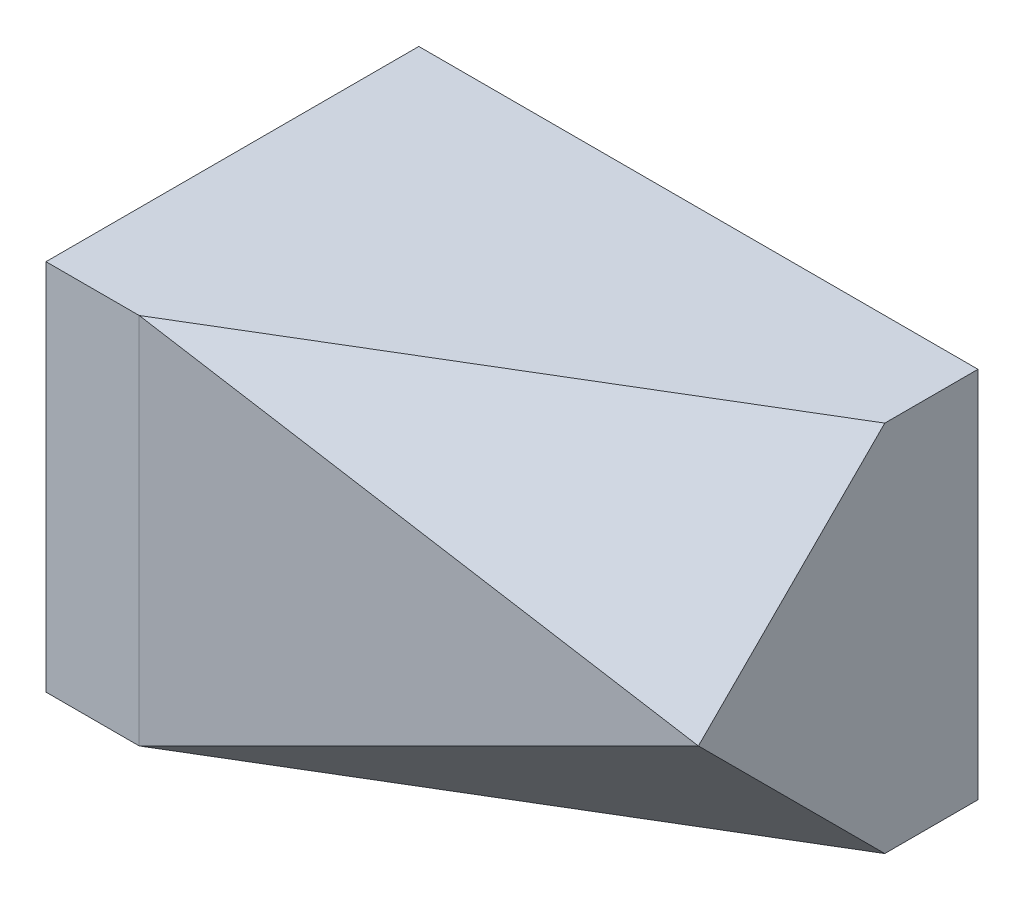
ISO-10303-21;
HEADER;
FILE_DESCRIPTION(('STEP AP214'),'2;1');
FILE_NAME('part.step','',(''),(''),'','','');
FILE_SCHEMA(('AUTOMOTIVE_DESIGN { 1 0 10303 214 1 1 1 1 }'));
ENDSEC;
DATA;
#1=APPLICATION_CONTEXT('core data for automotive mechanical design processes');
#2=APPLICATION_PROTOCOL_DEFINITION('international standard','automotive_design',2000,#1);
#3=PRODUCT_CONTEXT('',#1,'mechanical');
#4=PRODUCT('Part','Part','',(#3));
#5=PRODUCT_RELATED_PRODUCT_CATEGORY('part','',(#4));
#6=PRODUCT_DEFINITION_FORMATION('','',#4);
#7=PRODUCT_DEFINITION_CONTEXT('part definition',#1,'design');
#8=PRODUCT_DEFINITION('design','',#6,#7);
#9=PRODUCT_DEFINITION_SHAPE('','',#8);
#10=(LENGTH_UNIT() NAMED_UNIT(*) SI_UNIT(.MILLI.,.METRE.));
#11=(NAMED_UNIT(*) PLANE_ANGLE_UNIT() SI_UNIT($,.RADIAN.));
#12=(NAMED_UNIT(*) SI_UNIT($,.STERADIAN.) SOLID_ANGLE_UNIT());
#13=UNCERTAINTY_MEASURE_WITH_UNIT(LENGTH_MEASURE(1.E-05),#10,'distance_accuracy_value','');
#14=(GEOMETRIC_REPRESENTATION_CONTEXT(3) GLOBAL_UNCERTAINTY_ASSIGNED_CONTEXT((#13)) GLOBAL_UNIT_ASSIGNED_CONTEXT((#10,
#11,#12)) REPRESENTATION_CONTEXT('',''));
#15=CARTESIAN_POINT('',(0.,0.,0.));
#16=DIRECTION('',(0.,0.,1.));
#17=DIRECTION('',(1.,0.,0.));
#18=AXIS2_PLACEMENT_3D('',#15,#16,#17);
#19=CARTESIAN_POINT('',(-30.,20.,40.));
#20=DIRECTION('',(0.,-1.,0.));
#21=DIRECTION('',(0.,0.,-1.));
#22=AXIS2_PLACEMENT_3D('',#19,#20,#21);
#23=PLANE('',#22);
#24=DIRECTION('',(0.980580675690921,0.,-0.196116135138181));
#25=VECTOR('',#24,1.);
#26=CARTESIAN_POINT('',(-20.0000000000009,20.,40.));
#27=LINE('',#26,#25);
#28=CARTESIAN_POINT('',(-20.0000000000009,20.,40.));
#29=VERTEX_POINT('',#28);
#30=CARTESIAN_POINT('',(-19.9998086534801,20.,39.9999617306959));
#31=VERTEX_POINT('',#30);
#32=EDGE_CURVE('E121',#29,#31,#27,.T.);
#33=ORIENTED_EDGE('',*,*,#32,.T.);
#34=DIRECTION('',(0.85749234661034,0.,-0.514496720596636));
#35=VECTOR('',#34,1.);
#36=CARTESIAN_POINT('',(-27.3528974777505,20.,44.4118262812048));
#37=LINE('',#36,#35);
#38=CARTESIAN_POINT('',(30.,20.,9.99999999999999));
#39=VERTEX_POINT('',#38);
#40=EDGE_CURVE('E11',#31,#39,#37,.T.);
#41=ORIENTED_EDGE('',*,*,#40,.T.);
#42=DIRECTION('',(0.,0.,-1.));
#43=VECTOR('',#42,1.);
#44=CARTESIAN_POINT('',(30.,20.,40.));
#45=LINE('',#44,#43);
#46=CARTESIAN_POINT('',(30.,20.,0.));
#47=VERTEX_POINT('',#46);
#48=EDGE_CURVE('E112',#39,#47,#45,.T.);
#49=ORIENTED_EDGE('',*,*,#48,.T.);
#50=DIRECTION('',(-1.,0.,0.));
#51=VECTOR('',#50,1.);
#52=CARTESIAN_POINT('',(-30.,20.,0.));
#53=LINE('',#52,#51);
#54=CARTESIAN_POINT('',(-30.,20.,0.));
#55=VERTEX_POINT('',#54);
#56=EDGE_CURVE('E142',#47,#55,#53,.T.);
#57=ORIENTED_EDGE('',*,*,#56,.T.);
#58=DIRECTION('',(0.,0.,-1.));
#59=VECTOR('',#58,1.);
#60=CARTESIAN_POINT('',(-30.,20.,40.));
#61=LINE('',#60,#59);
#62=CARTESIAN_POINT('',(-30.,20.,40.));
#63=VERTEX_POINT('',#62);
#64=EDGE_CURVE('E130',#63,#55,#61,.T.);
#65=ORIENTED_EDGE('',*,*,#64,.F.);
#66=DIRECTION('',(-1.,0.,0.));
#67=VECTOR('',#66,1.);
#68=CARTESIAN_POINT('',(-30.,20.,40.));
#69=LINE('',#68,#67);
#70=EDGE_CURVE('E138',#29,#63,#69,.T.);
#71=ORIENTED_EDGE('',*,*,#70,.F.);
#72=EDGE_LOOP('',(#33,#41,#49,#57,#65,#71));
#73=FACE_BOUND('',#72,.T.);
#74=ADVANCED_FACE('F41',(#73),#23,.F.);
#75=CARTESIAN_POINT('',(30.,20.,40.));
#76=DIRECTION('',(-1.,0.,0.));
#77=DIRECTION('',(0.,-1.,0.));
#78=AXIS2_PLACEMENT_3D('',#75,#76,#77);
#79=PLANE('',#78);
#80=ORIENTED_EDGE('',*,*,#48,.F.);
#81=DIRECTION('',(0.,-0.707106781186547,0.707106781186547));
#82=VECTOR('',#81,1.);
#83=CARTESIAN_POINT('',(30.,5.,25.));
#84=LINE('',#83,#82);
#85=CARTESIAN_POINT('',(30.,0.,30.));
#86=VERTEX_POINT('',#85);
#87=EDGE_CURVE('E49',#39,#86,#84,.T.);
#88=ORIENTED_EDGE('',*,*,#87,.T.);
#89=DIRECTION('',(0.,0.707106781186548,0.707106781186548));
#90=VECTOR('',#89,1.);
#91=CARTESIAN_POINT('',(30.,15.,45.));
#92=LINE('',#91,#90);
#93=CARTESIAN_POINT('',(30.,-20.,9.99999999999999));
#94=VERTEX_POINT('',#93);
#95=EDGE_CURVE('E107',#94,#86,#92,.T.);
#96=ORIENTED_EDGE('',*,*,#95,.F.);
#97=DIRECTION('',(0.,0.,-1.));
#98=VECTOR('',#97,1.);
#99=CARTESIAN_POINT('',(30.,-20.,40.));
#100=LINE('',#99,#98);
#101=CARTESIAN_POINT('',(30.,-20.,0.));
#102=VERTEX_POINT('',#101);
#103=EDGE_CURVE('E135',#94,#102,#100,.T.);
#104=ORIENTED_EDGE('',*,*,#103,.T.);
#105=DIRECTION('',(0.,1.,0.));
#106=VECTOR('',#105,1.);
#107=CARTESIAN_POINT('',(30.,20.,0.));
#108=LINE('',#107,#106);
#109=EDGE_CURVE('E145',#102,#47,#108,.T.);
#110=ORIENTED_EDGE('',*,*,#109,.T.);
#111=EDGE_LOOP('',(#80,#88,#96,#104,#110));
#112=FACE_BOUND('',#111,.T.);
#113=ADVANCED_FACE('F110',(#112),#79,.F.);
#114=CARTESIAN_POINT('',(-20.0000000000009,0.,40.));
#115=DIRECTION('',(0.196116135138181,0.,0.980580675690921));
#116=DIRECTION('',(0.,-1.,0.));
#117=AXIS2_PLACEMENT_3D('',#114,#115,#116);
#118=PLANE('',#117);
#119=DIRECTION('',(0.912870463373825,-0.365149582751569,-0.182574092674762));
#120=VECTOR('',#119,1.);
#121=CARTESIAN_POINT('',(-13.3332891108185,17.3333819779738,38.6666578221636));
#122=LINE('',#121,#120);
#123=EDGE_CURVE('E96',#31,#86,#122,.T.);
#124=ORIENTED_EDGE('',*,*,#123,.F.);
#125=ORIENTED_EDGE('',*,*,#32,.F.);
#126=DIRECTION('',(0.,1.,0.));
#127=VECTOR('',#126,1.);
#128=CARTESIAN_POINT('',(-20.0000000000009,20.,40.));
#129=LINE('',#128,#127);
#130=CARTESIAN_POINT('',(-20.0000000000009,-20.,40.));
#131=VERTEX_POINT('',#130);
#132=EDGE_CURVE('E124',#131,#29,#129,.T.);
#133=ORIENTED_EDGE('',*,*,#132,.F.);
#134=DIRECTION('',(-0.980580675690921,0.,0.196116135138181));
#135=VECTOR('',#134,1.);
#136=CARTESIAN_POINT('',(-20.0000000000009,-20.,40.));
#137=LINE('',#136,#135);
#138=CARTESIAN_POINT('',(-19.9998086534801,-20.,39.9999617306958));
#139=VERTEX_POINT('',#138);
#140=EDGE_CURVE('E65',#139,#131,#137,.T.);
#141=ORIENTED_EDGE('',*,*,#140,.F.);
#142=DIRECTION('',(0.912870463373825,0.365149582751569,-0.182574092674762));
#143=VECTOR('',#142,1.);
#144=CARTESIAN_POINT('',(-13.3332891108185,-17.3333819779738,38.6666578221636));
#145=LINE('',#144,#143);
#146=EDGE_CURVE('E101',#139,#86,#145,.T.);
#147=ORIENTED_EDGE('',*,*,#146,.T.);
#148=EDGE_LOOP('',(#124,#125,#133,#141,#147));
#149=FACE_BOUND('',#148,.T.);
#150=ADVANCED_FACE('F42',(#149),#118,.T.);
#151=CARTESIAN_POINT('',(-30.,20.,40.));
#152=DIRECTION('',(1.,0.,0.));
#153=DIRECTION('',(0.,1.,0.));
#154=AXIS2_PLACEMENT_3D('',#151,#152,#153);
#155=PLANE('',#154);
#156=DIRECTION('',(0.,-1.,0.));
#157=VECTOR('',#156,1.);
#158=CARTESIAN_POINT('',(-30.,20.,0.));
#159=LINE('',#158,#157);
#160=CARTESIAN_POINT('',(-30.,-20.,0.));
#161=VERTEX_POINT('',#160);
#162=EDGE_CURVE('E140',#55,#161,#159,.T.);
#163=ORIENTED_EDGE('',*,*,#162,.T.);
#164=DIRECTION('',(0.,0.,-1.));
#165=VECTOR('',#164,1.);
#166=CARTESIAN_POINT('',(-30.,-20.,40.));
#167=LINE('',#166,#165);
#168=CARTESIAN_POINT('',(-30.,-20.,40.));
#169=VERTEX_POINT('',#168);
#170=EDGE_CURVE('E128',#169,#161,#167,.T.);
#171=ORIENTED_EDGE('',*,*,#170,.F.);
#172=DIRECTION('',(0.,-1.,0.));
#173=VECTOR('',#172,1.);
#174=CARTESIAN_POINT('',(-30.,20.,40.));
#175=LINE('',#174,#173);
#176=EDGE_CURVE('E150',#63,#169,#175,.T.);
#177=ORIENTED_EDGE('',*,*,#176,.F.);
#178=ORIENTED_EDGE('',*,*,#64,.T.);
#179=EDGE_LOOP('',(#163,#171,#177,#178));
#180=FACE_BOUND('',#179,.T.);
#181=ADVANCED_FACE('F157',(#180),#155,.F.);
#182=CARTESIAN_POINT('',(-30.,-20.,40.));
#183=DIRECTION('',(0.,1.,0.));
#184=DIRECTION('',(0.,0.,1.));
#185=AXIS2_PLACEMENT_3D('',#182,#183,#184);
#186=PLANE('',#185);
#187=DIRECTION('',(0.85749234661034,0.,-0.514496720596636));
#188=VECTOR('',#187,1.);
#189=CARTESIAN_POINT('',(-27.3528974777505,-20.,44.4118262812048));
#190=LINE('',#189,#188);
#191=EDGE_CURVE('E111',#139,#94,#190,.T.);
#192=ORIENTED_EDGE('',*,*,#191,.F.);
#193=ORIENTED_EDGE('',*,*,#140,.T.);
#194=DIRECTION('',(1.,0.,0.));
#195=VECTOR('',#194,1.);
#196=CARTESIAN_POINT('',(-30.,-20.,40.));
#197=LINE('',#196,#195);
#198=EDGE_CURVE('E132',#169,#131,#197,.T.);
#199=ORIENTED_EDGE('',*,*,#198,.F.);
#200=ORIENTED_EDGE('',*,*,#170,.T.);
#201=DIRECTION('',(1.,0.,0.));
#202=VECTOR('',#201,1.);
#203=CARTESIAN_POINT('',(-30.,-20.,0.));
#204=LINE('',#203,#202);
#205=EDGE_CURVE('E136',#161,#102,#204,.T.);
#206=ORIENTED_EDGE('',*,*,#205,.T.);
#207=ORIENTED_EDGE('',*,*,#103,.F.);
#208=EDGE_LOOP('',(#192,#193,#199,#200,#206,#207));
#209=FACE_BOUND('',#208,.T.);
#210=ADVANCED_FACE('F161',(#209),#186,.F.);
#211=CARTESIAN_POINT('',(0.,0.,40.));
#212=DIRECTION('',(0.,0.,1.));
#213=DIRECTION('',(1.,0.,0.));
#214=AXIS2_PLACEMENT_3D('',#211,#212,#213);
#215=PLANE('',#214);
#216=ORIENTED_EDGE('',*,*,#198,.T.);
#217=ORIENTED_EDGE('',*,*,#132,.T.);
#218=ORIENTED_EDGE('',*,*,#70,.T.);
#219=ORIENTED_EDGE('',*,*,#176,.T.);
#220=EDGE_LOOP('',(#216,#217,#218,#219));
#221=FACE_BOUND('',#220,.T.);
#222=ADVANCED_FACE('F155',(#221),#215,.T.);
#223=CARTESIAN_POINT('',(0.,0.,0.));
#224=DIRECTION('',(0.,0.,1.));
#225=DIRECTION('',(1.,0.,0.));
#226=AXIS2_PLACEMENT_3D('',#223,#224,#225);
#227=PLANE('',#226);
#228=ORIENTED_EDGE('',*,*,#109,.F.);
#229=ORIENTED_EDGE('',*,*,#205,.F.);
#230=ORIENTED_EDGE('',*,*,#162,.F.);
#231=ORIENTED_EDGE('',*,*,#56,.F.);
#232=EDGE_LOOP('',(#228,#229,#230,#231));
#233=FACE_BOUND('',#232,.T.);
#234=ADVANCED_FACE('F163',(#233),#227,.F.);
#235=CARTESIAN_POINT('',(12.2034231417426,-20.3389866787815,20.3389866787815));
#236=DIRECTION('',(0.390567577392498,-0.650944301568788,0.650944301568788));
#237=DIRECTION('',(0.,-0.707106781186548,-0.707106781186548));
#238=AXIS2_PLACEMENT_3D('',#235,#236,#237);
#239=PLANE('',#238);
#240=ORIENTED_EDGE('',*,*,#191,.T.);
#241=ORIENTED_EDGE('',*,*,#95,.T.);
#242=ORIENTED_EDGE('',*,*,#146,.F.);
#243=EDGE_LOOP('',(#240,#241,#242));
#244=FACE_BOUND('',#243,.T.);
#245=ADVANCED_FACE('F114',(#244),#239,.T.);
#246=CARTESIAN_POINT('',(12.2034231417426,20.3389866787815,20.3389866787815));
#247=DIRECTION('',(-0.390567577392498,-0.650944301568788,-0.650944301568788));
#248=DIRECTION('',(0.,0.707106781186547,-0.707106781186547));
#249=AXIS2_PLACEMENT_3D('',#246,#247,#248);
#250=PLANE('',#249);
#251=ORIENTED_EDGE('',*,*,#40,.F.);
#252=ORIENTED_EDGE('',*,*,#123,.T.);
#253=ORIENTED_EDGE('',*,*,#87,.F.);
#254=EDGE_LOOP('',(#251,#252,#253));
#255=FACE_BOUND('',#254,.T.);
#256=ADVANCED_FACE('F100',(#255),#250,.F.);
#257=CLOSED_SHELL('',(#74,#113,#150,#181,#210,#222,#234,#245,#256));
#258=MANIFOLD_SOLID_BREP('B2',#257);
#259=ADVANCED_BREP_SHAPE_REPRESENTATION('',(#18,#258),#14);
#260=SHAPE_DEFINITION_REPRESENTATION(#9,#259);
ENDSEC;
END-ISO-10303-21;
